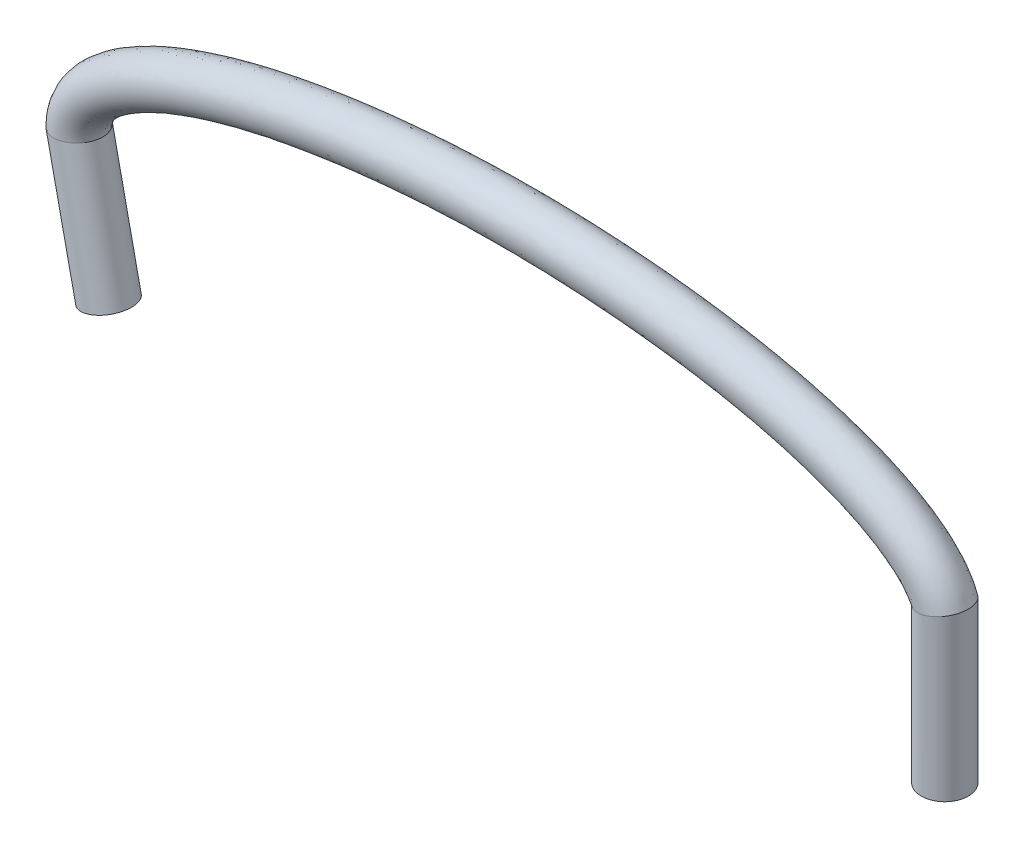
ISO-10303-21;
HEADER;
FILE_DESCRIPTION(('STEP AP214'),'2;1');
FILE_NAME('part.step','',(''),(''),'','','');
FILE_SCHEMA(('AUTOMOTIVE_DESIGN { 1 0 10303 214 1 1 1 1 }'));
ENDSEC;
DATA;
#1=APPLICATION_CONTEXT('core data for automotive mechanical design processes');
#2=APPLICATION_PROTOCOL_DEFINITION('international standard','automotive_design',2000,#1);
#3=PRODUCT_CONTEXT('',#1,'mechanical');
#4=PRODUCT('Part','Part','',(#3));
#5=PRODUCT_RELATED_PRODUCT_CATEGORY('part','',(#4));
#6=PRODUCT_DEFINITION_FORMATION('','',#4);
#7=PRODUCT_DEFINITION_CONTEXT('part definition',#1,'design');
#8=PRODUCT_DEFINITION('design','',#6,#7);
#9=PRODUCT_DEFINITION_SHAPE('','',#8);
#10=(LENGTH_UNIT() NAMED_UNIT(*) SI_UNIT(.MILLI.,.METRE.));
#11=(NAMED_UNIT(*) PLANE_ANGLE_UNIT() SI_UNIT($,.RADIAN.));
#12=(NAMED_UNIT(*) SI_UNIT($,.STERADIAN.) SOLID_ANGLE_UNIT());
#13=UNCERTAINTY_MEASURE_WITH_UNIT(LENGTH_MEASURE(1.E-05),#10,'distance_accuracy_value','');
#14=(GEOMETRIC_REPRESENTATION_CONTEXT(3) GLOBAL_UNCERTAINTY_ASSIGNED_CONTEXT((#13)) GLOBAL_UNIT_ASSIGNED_CONTEXT((#10,
#11,#12)) REPRESENTATION_CONTEXT('',''));
#15=CARTESIAN_POINT('',(0.,0.,0.));
#16=DIRECTION('',(0.,0.,1.));
#17=DIRECTION('',(1.,0.,0.));
#18=AXIS2_PLACEMENT_3D('',#15,#16,#17);
#19=CARTESIAN_POINT('',(18.5,-22.0918820107963,0.));
#20=DIRECTION('',(0.,1.,0.));
#21=DIRECTION('',(-1.,0.,0.));
#22=AXIS2_PLACEMENT_3D('',#19,#20,#21);
#23=PLANE('',#22);
#24=CARTESIAN_POINT('',(18.5,-22.0918820107963,0.));
#25=DIRECTION('',(0.,1.,0.));
#26=DIRECTION('',(-1.,0.,0.));
#27=AXIS2_PLACEMENT_3D('',#24,#25,#26);
#28=CIRCLE('',#27,1.);
#29=CARTESIAN_POINT('',(17.5,-22.0918820107963,0.));
#30=VERTEX_POINT('',#29);
#31=EDGE_CURVE('E36',#30,#30,#28,.T.);
#32=ORIENTED_EDGE('',*,*,#31,.F.);
#33=EDGE_LOOP('',(#32));
#34=FACE_BOUND('',#33,.T.);
#35=ADVANCED_FACE('F33',(#34),#23,.F.);
#36=CARTESIAN_POINT('',(-17.1053505367524,-22.0918820107963,0.));
#37=DIRECTION('',(0.210433069841335,-0.977608266698452,0.));
#38=DIRECTION('',(0.977608266698452,0.210433069841335,0.));
#39=AXIS2_PLACEMENT_3D('',#36,#37,#38);
#40=PLANE('',#39);
#41=CARTESIAN_POINT('',(-17.1053505367524,-22.0918820107963,0.));
#42=DIRECTION('',(0.210433069841335,-0.977608266698452,0.));
#43=DIRECTION('',(0.977608266698452,0.210433069841335,0.));
#44=AXIS2_PLACEMENT_3D('',#41,#42,#43);
#45=CIRCLE('',#44,1.);
#46=CARTESIAN_POINT('',(-16.127742270054,-21.881448940955,0.));
#47=VERTEX_POINT('',#46);
#48=EDGE_CURVE('E62',#47,#47,#45,.T.);
#49=ORIENTED_EDGE('',*,*,#48,.T.);
#50=EDGE_LOOP('',(#49));
#51=FACE_BOUND('',#50,.T.);
#52=ADVANCED_FACE('F115',(#51),#40,.T.);
#53=CARTESIAN_POINT('',(18.5,-15.0771752101522,0.));
#54=DIRECTION('',(0.,-1.,0.));
#55=DIRECTION('',(0.,0.,-1.));
#56=AXIS2_PLACEMENT_3D('',#53,#54,#55);
#57=CYLINDRICAL_SURFACE('',#56,1.);
#58=CARTESIAN_POINT('',(18.5,-15.3876234333942,-1.));
#59=CARTESIAN_POINT('',(18.5034071680893,-15.3869713902976,-1.00000011168417));
#60=CARTESIAN_POINT('',(18.5068148719893,-15.3863192490515,-0.999982686887696));
#61=CARTESIAN_POINT('',(18.5672662540041,-15.3747505856356,-0.999362886241515));
#62=CARTESIAN_POINT('',(18.6243976340839,-15.3638184812078,-0.993870405681347));
#63=CARTESIAN_POINT('',(18.7087591855946,-15.3476771138013,-0.978389097868317));
#64=CARTESIAN_POINT('',(18.7367013229754,-15.3423309992677,-0.972005306765891));
#65=CARTESIAN_POINT('',(18.7919850245974,-15.3317540272957,-0.956852060895181));
#66=CARTESIAN_POINT('',(18.8193260855698,-15.3265232664299,-0.948080683548789));
#67=CARTESIAN_POINT('',(18.8999563874864,-15.3110978814834,-0.918317684635702));
#68=CARTESIAN_POINT('',(18.9520451689388,-15.3011333390725,-0.893841721528193));
#69=CARTESIAN_POINT('',(19.0513799890603,-15.2821310366282,-0.836227049486676));
#70=CARTESIAN_POINT('',(19.0986263349762,-15.2730932177953,-0.80308889063311));
#71=CARTESIAN_POINT('',(19.1645253621273,-15.2604870561311,-0.747809866972191));
#72=CARTESIAN_POINT('',(19.1855713505741,-15.2564610182748,-0.728563482772165));
#73=CARTESIAN_POINT('',(19.2259542611553,-15.2487357527525,-0.688332931103869));
#74=CARTESIAN_POINT('',(19.245292805214,-15.2450362149413,-0.667350450300825));
#75=CARTESIAN_POINT('',(19.3005572813311,-15.2344636609964,-0.601962275481523));
#76=CARTESIAN_POINT('',(19.3337497235881,-15.2281133249264,-0.555101023317482));
#77=CARTESIAN_POINT('',(19.3911803361063,-15.217125845695,-0.457132697542114));
#78=CARTESIAN_POINT('',(19.4155635319205,-15.2124609551663,-0.406113139942955));
#79=CARTESIAN_POINT('',(19.4554216384327,-15.2048354527005,-0.300579503976562));
#80=CARTESIAN_POINT('',(19.4708975946214,-15.2018746407465,-0.246065836566953));
#81=CARTESIAN_POINT('',(19.4922666956468,-15.1977863744143,-0.136016244230443));
#82=CARTESIAN_POINT('',(19.4983061161599,-15.1966309349675,-0.08050969778011));
#83=CARTESIAN_POINT('',(19.5010745989969,-15.1961012781036,0.0307426813230176));
#84=CARTESIAN_POINT('',(19.4978041539728,-15.1967269664344,0.0864885011582694));
#85=CARTESIAN_POINT('',(19.4821135600055,-15.1997288411828,0.196223356533387));
#86=CARTESIAN_POINT('',(19.4697582203991,-15.2020926284431,0.250222021607091));
#87=CARTESIAN_POINT('',(19.4363572011949,-15.2084827803738,0.355355388444005));
#88=CARTESIAN_POINT('',(19.4153114181078,-15.212509164843,0.406490056093341));
#89=CARTESIAN_POINT('',(19.365058427566,-15.2221234559606,0.504708756647112));
#90=CARTESIAN_POINT('',(19.3358148028229,-15.2277183303207,0.551773459970292));
#91=CARTESIAN_POINT('',(19.2700823125392,-15.2402938006343,0.640323203424636));
#92=CARTESIAN_POINT('',(19.2335932975311,-15.2472744251747,0.68180812841914));
#93=CARTESIAN_POINT('',(19.1531536644653,-15.2626624951972,0.759349766379656));
#94=CARTESIAN_POINT('',(19.1090004441389,-15.271108679391,0.795188405156664));
#95=CARTESIAN_POINT('',(19.0153863001771,-15.289016447517,0.858823217676782));
#96=CARTESIAN_POINT('',(18.965924729475,-15.2984781552375,0.886618409426158));
#97=CARTESIAN_POINT('',(18.888868443815,-15.3132191919409,0.921727957884239));
#98=CARTESIAN_POINT('',(18.8626790537615,-15.3182293800204,0.932340981711951));
#99=CARTESIAN_POINT('',(18.8095497274686,-15.3283936248793,0.951301358408338));
#100=CARTESIAN_POINT('',(18.7826104811958,-15.3335475494102,0.959650722801023));
#101=CARTESIAN_POINT('',(18.7009928739623,-15.3491628817283,0.981201344359177));
#102=CARTESIAN_POINT('',(18.6453824506128,-15.3598031364425,0.990965142356056));
#103=CARTESIAN_POINT('',(18.5630848617622,-15.3755510463764,0.998360522662757));
#104=CARTESIAN_POINT('',(18.5366582422763,-15.3806080829113,0.999677668155914));
#105=CARTESIAN_POINT('',(18.5068153583288,-15.3863191559375,0.999982557937185));
#106=CARTESIAN_POINT('',(18.5034076815071,-15.3869712919978,0.999999973561581));
#107=CARTESIAN_POINT('',(18.5,-15.3876234333942,1.));
#108=B_SPLINE_CURVE_WITH_KNOTS('',3,(#58,#59,#60,#61,#62,#63,#64,#65,#66,#67,#68,#69,#70,#71,
#72,#73,#74,#75,#76,#77,#78,#79,#80,#81,#82,#83,#84,#85,#86,#87,#88,#89,#90,#91,#92,#93,#94,#95,
#96,#97,#98,#99,#100,#101,#102,#103,#104,#105,#106,#107),.UNSPECIFIED.,.F.,.F.,(4,2,2,2,2,2,2,2,
2,2,2,2,2,2,2,2,2,2,2,2,2,2,2,2,4),(0.,0.0104085368731022,0.184626497572387,0.272019280926984,
0.35948264562771,0.53381988188447,0.708146049791018,0.794460351780664,0.880691760144661,
1.05308556487375,1.22249583451572,1.39188621550336,1.55862386667755,1.72535269472822,
1.89090352129508,2.05645631936496,2.22275653598815,2.38906018362843,2.56072440330985,
2.73240957198708,2.81841818874864,2.90435012449157,3.07577712573474,3.15652570290149,
3.1669342397746),.UNSPECIFIED.);
#109=CARTESIAN_POINT('',(18.5,-15.3876234333942,1.));
#110=VERTEX_POINT('',#109);
#111=CARTESIAN_POINT('',(18.5,-15.3876234333942,-1.));
#112=VERTEX_POINT('',#111);
#113=EDGE_CURVE('E58',#110,#112,#108,.F.);
#114=ORIENTED_EDGE('',*,*,#113,.F.);
#115=CARTESIAN_POINT('',(18.5,-15.3876234333942,-1.));
#116=CARTESIAN_POINT('',(18.4965928286844,-15.3882754804214,-1.00000011070626));
#117=CARTESIAN_POINT('',(18.493185266396,-15.3889283598357,-0.999982686021337));
#118=CARTESIAN_POINT('',(18.4326169540965,-15.4005464738293,-0.999361726896883));
#119=CARTESIAN_POINT('',(18.3754082447468,-15.4117321803997,-0.993848499097518));
#120=CARTESIAN_POINT('',(18.290987589085,-15.4285353492138,-0.97833567478781));
#121=CARTESIAN_POINT('',(18.2630349749947,-15.43414968744,-0.971941188813213));
#122=CARTESIAN_POINT('',(18.20774780652,-15.4453558543851,-0.956770592280345));
#123=CARTESIAN_POINT('',(18.1804137566035,-15.4509476618766,-0.947992608686158));
#124=CARTESIAN_POINT('',(18.0997791263223,-15.467601095226,-0.91820409508037));
#125=CARTESIAN_POINT('',(18.0477039840717,-15.4785690132444,-0.893712741458573));
#126=CARTESIAN_POINT('',(17.9484317991619,-15.4999259046885,-0.8361013047111));
#127=CARTESIAN_POINT('',(17.90123464272,-15.5103148916156,-0.802981422915928));
#128=CARTESIAN_POINT('',(17.8352677207173,-15.5251692281471,-0.747631713316786));
#129=CARTESIAN_POINT('',(17.814115858528,-15.5299914656301,-0.728275027798148));
#130=CARTESIAN_POINT('',(17.7735391472838,-15.5393475940673,-0.687804637185025));
#131=CARTESIAN_POINT('',(17.7541126630433,-15.5438817568515,-0.666692633207164));
#132=CARTESIAN_POINT('',(17.6986089702993,-15.5569762452922,-0.60088231168597));
#133=CARTESIAN_POINT('',(17.6652896892878,-15.5650326207414,-0.553694718162623));
#134=CARTESIAN_POINT('',(17.6077198107193,-15.5791499800577,-0.455019697835641));
#135=CARTESIAN_POINT('',(17.5833137905301,-15.5852449167796,-0.403627240238924));
#136=CARTESIAN_POINT('',(17.5435174494442,-15.5952472230538,-0.297257056986469));
#137=CARTESIAN_POINT('',(17.5281251527682,-15.5991550720003,-0.242280119975515));
#138=CARTESIAN_POINT('',(17.5072095003438,-15.6044740481307,-0.132009436559815));
#139=CARTESIAN_POINT('',(17.501415116711,-15.6059537306695,-0.0767702474726794));
#140=CARTESIAN_POINT('',(17.4990440537265,-15.6065587261244,0.0339161797406809));
#141=CARTESIAN_POINT('',(17.5024664159315,-15.6056842838445,0.0893633956355612));
#142=CARTESIAN_POINT('',(17.5182889503006,-15.6016547129845,0.198023691642245));
#143=CARTESIAN_POINT('',(17.5305543766291,-15.5985338158104,0.251257764392653));
#144=CARTESIAN_POINT('',(17.563507534427,-15.590213426274,0.354877535001122));
#145=CARTESIAN_POINT('',(17.5841956662577,-15.5850138351041,0.405263097329649));
#146=CARTESIAN_POINT('',(17.6335891731106,-15.5727801243212,0.502321285025942));
#147=CARTESIAN_POINT('',(17.6623712687706,-15.5657284941628,0.548952599006745));
#148=CARTESIAN_POINT('',(17.7270078351728,-15.5502308199874,0.636754080261269));
#149=CARTESIAN_POINT('',(17.7628626158205,-15.5417847148711,0.677924008099926));
#150=CARTESIAN_POINT('',(17.8417245915707,-15.5236565028578,0.754844416202184));
#151=CARTESIAN_POINT('',(17.8849017540144,-15.5139467350507,0.790414146232975));
#152=CARTESIAN_POINT('',(17.9764626523598,-15.4938372761149,0.853820929733084));
#153=CARTESIAN_POINT('',(18.0248471170079,-15.4834374884982,0.881656898928594));
#154=CARTESIAN_POINT('',(18.1271003382322,-15.4619032008121,0.929643765325305));
#155=CARTESIAN_POINT('',(18.1810949599659,-15.4507558418426,0.949520578822793));
#156=CARTESIAN_POINT('',(18.2915770959666,-15.4283668013295,0.979708611362492));
#157=CARTESIAN_POINT('',(18.3480591935981,-15.4171253640919,0.990039633226803));
#158=CARTESIAN_POINT('',(18.4331674927052,-15.4004930557871,0.998167167018431));
#159=CARTESIAN_POINT('',(18.4614642743821,-15.3950130447986,0.999658382655558));
#160=CARTESIAN_POINT('',(18.4931848360287,-15.388928440405,0.9999825724651));
#161=CARTESIAN_POINT('',(18.4965923776406,-15.3882755646922,0.999999990001254));
#162=CARTESIAN_POINT('',(18.5,-15.3876234333942,1.));
#163=B_SPLINE_CURVE_WITH_KNOTS('',3,(#115,#116,#117,#118,#119,#120,#121,#122,#123,#124,#125,
#126,#127,#128,#129,#130,#131,#132,#133,#134,#135,#136,#137,#138,#139,#140,#141,#142,#143,#144,
#145,#146,#147,#148,#149,#150,#151,#152,#153,#154,#155,#156,#157,#158,#159,#160,#161,#162),
.UNSPECIFIED.,.F.,.F.,(4,2,2,2,2,2,2,2,2,2,2,2,2,2,2,2,2,2,2,2,2,2,2,4),(0.,0.0104085370919459,
0.184999077114313,0.272580610187836,0.360231168084822,0.535096322302397,0.70995739673527,
0.797088225139303,0.884135576042009,1.0581603136131,1.22898655867591,1.39977534514605,
1.56565360177947,1.73151460950934,1.89490033036613,2.05829381843569,2.22329153678548,
2.38829648648479,2.55785153672906,2.72743034662135,2.90242954005248,3.07706487576931,
3.16355545329765,3.17396399038966),.UNSPECIFIED.);
#164=EDGE_CURVE('E56',#110,#112,#163,.F.);
#165=ORIENTED_EDGE('',*,*,#164,.T.);
#166=EDGE_LOOP('',(#114,#165));
#167=FACE_BOUND('',#166,.T.);
#168=ORIENTED_EDGE('',*,*,#31,.T.);
#169=EDGE_LOOP('',(#168));
#170=FACE_BOUND('',#169,.T.);
#171=ADVANCED_FACE('F64',(#167,#170),#57,.T.);
#172=CARTESIAN_POINT('',(-17.3568653846911,-16.5227642811263,0.));
#173=CARTESIAN_POINT('',(-17.3560700431756,-16.4484340160359,0.));
#174=CARTESIAN_POINT('',(-17.3550663942075,-16.3542039101617,0.));
#175=CARTESIAN_POINT('',(-17.354115125704,-16.2660012802277,0.));
#176=CARTESIAN_POINT('',(-17.3532299627587,-16.2568803379146,0.));
#177=CARTESIAN_POINT('',(-17.3495523719888,-16.2135066566741,0.));
#178=CARTESIAN_POINT('',(-17.3468945255966,-16.1916005806689,0.));
#179=CARTESIAN_POINT('',(-17.3362709570493,-16.1247526938911,0.));
#180=CARTESIAN_POINT('',(-17.3256715369799,-16.0786444626232,0.));
#181=CARTESIAN_POINT('',(-17.2808629055453,-15.9330032470519,0.));
#182=CARTESIAN_POINT('',(-17.2334223268091,-15.8256748279237,0.));
#183=CARTESIAN_POINT('',(-17.0173676702873,-15.4710823820133,0.));
#184=CARTESIAN_POINT('',(-16.7716181071438,-15.1926492796887,0.));
#185=CARTESIAN_POINT('',(-15.686295899535,-14.3239488867966,0.));
#186=CARTESIAN_POINT('',(-14.5062444521368,-13.7154044226635,0.));
#187=CARTESIAN_POINT('',(-9.93849786971495,-12.1551463252879,0.));
#188=CARTESIAN_POINT('',(-5.51309893519682,-11.4658770701229,0.));
#189=CARTESIAN_POINT('',(3.5994306311149,-11.2429867241933,0.));
#190=CARTESIAN_POINT('',(8.25032867143602,-11.7071883405302,0.));
#191=CARTESIAN_POINT('',(13.4303489321272,-13.0454205527017,0.));
#192=CARTESIAN_POINT('',(14.8610452288692,-13.5961843537459,0.));
#193=CARTESIAN_POINT('',(16.3682732211967,-14.461097846119,0.));
#194=CARTESIAN_POINT('',(16.7633588713221,-14.7546905306458,0.));
#195=CARTESIAN_POINT('',(17.1853485218015,-15.1658906725606,0.));
#196=CARTESIAN_POINT('',(17.2976657476761,-15.2977032962204,0.));
#197=CARTESIAN_POINT('',(17.4270011429015,-15.4812839998081,0.));
#198=CARTESIAN_POINT('',(17.4636470404202,-15.5401196303962,0.));
#199=CARTESIAN_POINT('',(17.5253562827948,-15.6524376717752,0.));
#200=CARTESIAN_POINT('',(17.5423922560269,-15.6856921085446,0.));
#201=CARTESIAN_POINT('',(17.5854929929327,-15.7941865625705,0.));
#202=CARTESIAN_POINT('',(17.6088170576842,-15.8529208017803,0.));
#203=CARTESIAN_POINT('',(17.6470148658633,-15.9490956693489,0.));
#204=CARTESIAN_POINT('',(17.6661137699527,-15.9971831031331,0.));
#205=CARTESIAN_POINT('',(17.6852126740424,-16.0452705369178,0.));
#206=CARTESIAN_POINT('',(-17.3568653846911,-16.5227642811263,2.));
#207=CARTESIAN_POINT('',(-17.3560700431756,-16.4484340160359,2.));
#208=CARTESIAN_POINT('',(-17.3550663942075,-16.3542039101617,2.));
#209=CARTESIAN_POINT('',(-17.354115125704,-16.2660012802277,2.));
#210=CARTESIAN_POINT('',(-17.3532299627587,-16.2568803379146,2.));
#211=CARTESIAN_POINT('',(-17.3495523719888,-16.2135066566741,2.));
#212=CARTESIAN_POINT('',(-17.3468945255966,-16.1916005806689,2.));
#213=CARTESIAN_POINT('',(-17.3362709570493,-16.1247526938911,2.));
#214=CARTESIAN_POINT('',(-17.3256715369799,-16.0786444626232,2.));
#215=CARTESIAN_POINT('',(-17.2808629055453,-15.9330032470519,2.));
#216=CARTESIAN_POINT('',(-17.2334223268091,-15.8256748279237,2.));
#217=CARTESIAN_POINT('',(-17.0173676702873,-15.4710823820133,2.));
#218=CARTESIAN_POINT('',(-16.7716181071438,-15.1926492796887,2.));
#219=CARTESIAN_POINT('',(-15.686295899535,-14.3239488867966,2.));
#220=CARTESIAN_POINT('',(-14.5062444521368,-13.7154044226635,2.));
#221=CARTESIAN_POINT('',(-9.93849786971495,-12.1551463252879,2.));
#222=CARTESIAN_POINT('',(-5.51309893519682,-11.4658770701229,2.));
#223=CARTESIAN_POINT('',(3.5994306311149,-11.2429867241933,2.));
#224=CARTESIAN_POINT('',(8.25032867143602,-11.7071883405302,2.));
#225=CARTESIAN_POINT('',(13.4303489321272,-13.0454205527017,2.));
#226=CARTESIAN_POINT('',(14.8610452288692,-13.5961843537459,2.));
#227=CARTESIAN_POINT('',(16.3682732211967,-14.461097846119,2.));
#228=CARTESIAN_POINT('',(16.7633588713221,-14.7546905306458,2.));
#229=CARTESIAN_POINT('',(17.1853485218015,-15.1658906725606,2.));
#230=CARTESIAN_POINT('',(17.2976657476761,-15.2977032962204,2.));
#231=CARTESIAN_POINT('',(17.4270011429015,-15.4812839998081,2.));
#232=CARTESIAN_POINT('',(17.4636470404202,-15.5401196303962,2.));
#233=CARTESIAN_POINT('',(17.5253562827948,-15.6524376717752,2.));
#234=CARTESIAN_POINT('',(17.5423922560269,-15.6856921085446,2.));
#235=CARTESIAN_POINT('',(17.5854929929327,-15.7941865625705,2.));
#236=CARTESIAN_POINT('',(17.6088170576842,-15.8529208017803,2.));
#237=CARTESIAN_POINT('',(17.6470148658633,-15.9490956693489,2.));
#238=CARTESIAN_POINT('',(17.6661137699527,-15.9971831031331,2.));
#239=CARTESIAN_POINT('',(17.6852126740424,-16.0452705369178,2.));
#240=CARTESIAN_POINT('',(-19.3567509023106,-16.5013652994733,2.));
#241=CARTESIAN_POINT('',(-19.3559555607951,-16.4270350343828,2.));
#242=CARTESIAN_POINT('',(-19.3553884297776,-16.3726046739087,2.));
#243=CARTESIAN_POINT('',(-19.3537297989534,-16.219907925847,2.));
#244=CARTESIAN_POINT('',(-19.3502229480478,-16.1367788015735,2.));
#245=CARTESIAN_POINT('',(-19.3382582681438,-15.9956667388324,2.));
#246=CARTESIAN_POINT('',(-19.329678106729,-15.9253372045082,2.));
#247=CARTESIAN_POINT('',(-19.2963413250764,-15.7155683123746,2.));
#248=CARTESIAN_POINT('',(-19.2639688185088,-15.5773832627057,2.));
#249=CARTESIAN_POINT('',(-19.1389873190726,-15.1711565642984,2.));
#250=CARTESIAN_POINT('',(-19.0186915863862,-14.9119444147794,2.));
#251=CARTESIAN_POINT('',(-18.5706352949816,-14.1765869946014,2.));
#252=CARTESIAN_POINT('',(-18.1593221968438,-13.7416191926326,2.));
#253=CARTESIAN_POINT('',(-16.6602227844017,-12.5417282648995,2.));
#254=CARTESIAN_POINT('',(-15.296166832114,-11.8717676579409,2.));
#255=CARTESIAN_POINT('',(-10.2981170931632,-10.1645259267802,2.));
#256=CARTESIAN_POINT('',(-5.72197823142651,-9.47038801822618,2.));
#257=CARTESIAN_POINT('',(3.7105001155763,-9.2396717998089,2.));
#258=CARTESIAN_POINT('',(8.50624680750284,-9.70763932423022,2.));
#259=CARTESIAN_POINT('',(14.0527876652019,-11.1405602920568,2.));
#260=CARTESIAN_POINT('',(15.631602710787,-11.7324613695059,2.));
#261=CARTESIAN_POINT('',(17.4761464290715,-12.7909414179137,2.));
#262=CARTESIAN_POINT('',(18.0051706135181,-13.1722490223904,2.));
#263=CARTESIAN_POINT('',(18.6581171397731,-13.8085009143293,2.));
#264=CARTESIAN_POINT('',(18.8522033057169,-14.031636417053,2.));
#265=CARTESIAN_POINT('',(19.1022146522738,-14.3865065049665,2.));
#266=CARTESIAN_POINT('',(19.1786473748402,-14.5081520154196,2.));
#267=CARTESIAN_POINT('',(19.3160849755285,-14.7583045655609,2.));
#268=CARTESIAN_POINT('',(19.3850939264282,-14.9070375702809,2.));
#269=CARTESIAN_POINT('',(19.4527169537961,-15.0772346922898,2.));
#270=CARTESIAN_POINT('',(19.4675785586741,-15.1146758001459,2.));
#271=CARTESIAN_POINT('',(19.505776366853,-15.2108506677145,2.));
#272=CARTESIAN_POINT('',(19.5248752709428,-15.2589381014987,2.));
#273=CARTESIAN_POINT('',(19.5439741750322,-15.3070255352834,2.));
#274=CARTESIAN_POINT('',(-19.3567509023106,-16.5013652994733,0.));
#275=CARTESIAN_POINT('',(-19.3559555607951,-16.4270350343828,0.));
#276=CARTESIAN_POINT('',(-19.3553884297776,-16.3726046739087,0.));
#277=CARTESIAN_POINT('',(-19.3537297989534,-16.219907925847,0.));
#278=CARTESIAN_POINT('',(-19.3502229480478,-16.1367788015735,0.));
#279=CARTESIAN_POINT('',(-19.3382582681438,-15.9956667388324,0.));
#280=CARTESIAN_POINT('',(-19.329678106729,-15.9253372045082,0.));
#281=CARTESIAN_POINT('',(-19.2963413250764,-15.7155683123746,0.));
#282=CARTESIAN_POINT('',(-19.2639688185088,-15.5773832627057,0.));
#283=CARTESIAN_POINT('',(-19.1389873190726,-15.1711565642984,0.));
#284=CARTESIAN_POINT('',(-19.0186915863862,-14.9119444147794,0.));
#285=CARTESIAN_POINT('',(-18.5706352949816,-14.1765869946014,0.));
#286=CARTESIAN_POINT('',(-18.1593221968438,-13.7416191926326,0.));
#287=CARTESIAN_POINT('',(-16.6602227844017,-12.5417282648995,0.));
#288=CARTESIAN_POINT('',(-15.296166832114,-11.8717676579409,0.));
#289=CARTESIAN_POINT('',(-10.2981170931632,-10.1645259267802,0.));
#290=CARTESIAN_POINT('',(-5.72197823142651,-9.47038801822618,0.));
#291=CARTESIAN_POINT('',(3.7105001155763,-9.2396717998089,0.));
#292=CARTESIAN_POINT('',(8.50624680750284,-9.70763932423022,0.));
#293=CARTESIAN_POINT('',(14.0527876652019,-11.1405602920568,0.));
#294=CARTESIAN_POINT('',(15.631602710787,-11.7324613695059,0.));
#295=CARTESIAN_POINT('',(17.4761464290715,-12.7909414179137,0.));
#296=CARTESIAN_POINT('',(18.0051706135181,-13.1722490223904,0.));
#297=CARTESIAN_POINT('',(18.6581171397731,-13.8085009143293,0.));
#298=CARTESIAN_POINT('',(18.8522033057169,-14.031636417053,0.));
#299=CARTESIAN_POINT('',(19.1022146522738,-14.3865065049665,0.));
#300=CARTESIAN_POINT('',(19.1786473748402,-14.5081520154196,0.));
#301=CARTESIAN_POINT('',(19.3160849755285,-14.7583045655609,0.));
#302=CARTESIAN_POINT('',(19.3850939264282,-14.9070375702809,0.));
#303=CARTESIAN_POINT('',(19.4527169537961,-15.0772346922898,0.));
#304=CARTESIAN_POINT('',(19.4675785586741,-15.1146758001459,0.));
#305=CARTESIAN_POINT('',(19.505776366853,-15.2108506677145,0.));
#306=CARTESIAN_POINT('',(19.5248752709428,-15.2589381014987,0.));
#307=CARTESIAN_POINT('',(19.5439741750322,-15.3070255352834,0.));
#308=CARTESIAN_POINT('',(-19.3567509023106,-16.5013652994733,-2.));
#309=CARTESIAN_POINT('',(-19.3559555607951,-16.4270350343828,-2.));
#310=CARTESIAN_POINT('',(-19.3553884297776,-16.3726046739087,-2.));
#311=CARTESIAN_POINT('',(-19.3537297989534,-16.219907925847,-2.));
#312=CARTESIAN_POINT('',(-19.3502229480478,-16.1367788015735,-2.));
#313=CARTESIAN_POINT('',(-19.3382582681438,-15.9956667388324,-2.));
#314=CARTESIAN_POINT('',(-19.329678106729,-15.9253372045082,-2.));
#315=CARTESIAN_POINT('',(-19.2963413250764,-15.7155683123746,-2.));
#316=CARTESIAN_POINT('',(-19.2639688185088,-15.5773832627057,-2.));
#317=CARTESIAN_POINT('',(-19.1389873190726,-15.1711565642984,-2.));
#318=CARTESIAN_POINT('',(-19.0186915863862,-14.9119444147794,-2.));
#319=CARTESIAN_POINT('',(-18.5706352949816,-14.1765869946014,-2.));
#320=CARTESIAN_POINT('',(-18.1593221968438,-13.7416191926326,-2.));
#321=CARTESIAN_POINT('',(-16.6602227844017,-12.5417282648995,-2.));
#322=CARTESIAN_POINT('',(-15.296166832114,-11.8717676579409,-2.));
#323=CARTESIAN_POINT('',(-10.2981170931632,-10.1645259267802,-2.));
#324=CARTESIAN_POINT('',(-5.72197823142651,-9.47038801822618,-2.));
#325=CARTESIAN_POINT('',(3.7105001155763,-9.2396717998089,-2.));
#326=CARTESIAN_POINT('',(8.50624680750284,-9.70763932423022,-2.));
#327=CARTESIAN_POINT('',(14.0527876652019,-11.1405602920568,-2.));
#328=CARTESIAN_POINT('',(15.631602710787,-11.7324613695059,-2.));
#329=CARTESIAN_POINT('',(17.4761464290715,-12.7909414179137,-2.));
#330=CARTESIAN_POINT('',(18.0051706135181,-13.1722490223904,-2.));
#331=CARTESIAN_POINT('',(18.6581171397731,-13.8085009143293,-2.));
#332=CARTESIAN_POINT('',(18.8522033057169,-14.031636417053,-2.));
#333=CARTESIAN_POINT('',(19.1022146522738,-14.3865065049665,-2.));
#334=CARTESIAN_POINT('',(19.1786473748402,-14.5081520154196,-2.));
#335=CARTESIAN_POINT('',(19.3160849755285,-14.7583045655609,-2.));
#336=CARTESIAN_POINT('',(19.3850939264282,-14.9070375702809,-2.));
#337=CARTESIAN_POINT('',(19.4527169537961,-15.0772346922898,-2.));
#338=CARTESIAN_POINT('',(19.4675785586741,-15.1146758001459,-2.));
#339=CARTESIAN_POINT('',(19.505776366853,-15.2108506677145,-2.));
#340=CARTESIAN_POINT('',(19.5248752709428,-15.2589381014987,-2.));
#341=CARTESIAN_POINT('',(19.5439741750322,-15.3070255352834,-2.));
#342=CARTESIAN_POINT('',(-17.3568653846911,-16.5227642811263,-2.));
#343=CARTESIAN_POINT('',(-17.3560700431756,-16.4484340160359,-2.));
#344=CARTESIAN_POINT('',(-17.3550663942075,-16.3542039101617,-2.));
#345=CARTESIAN_POINT('',(-17.354115125704,-16.2660012802277,-2.));
#346=CARTESIAN_POINT('',(-17.3532299627587,-16.2568803379146,-2.));
#347=CARTESIAN_POINT('',(-17.3495523719888,-16.2135066566741,-2.));
#348=CARTESIAN_POINT('',(-17.3468945255966,-16.1916005806689,-2.));
#349=CARTESIAN_POINT('',(-17.3362709570493,-16.1247526938911,-2.));
#350=CARTESIAN_POINT('',(-17.3256715369799,-16.0786444626232,-2.));
#351=CARTESIAN_POINT('',(-17.2808629055453,-15.9330032470519,-2.));
#352=CARTESIAN_POINT('',(-17.2334223268091,-15.8256748279237,-2.));
#353=CARTESIAN_POINT('',(-17.0173676702873,-15.4710823820133,-2.));
#354=CARTESIAN_POINT('',(-16.7716181071438,-15.1926492796887,-2.));
#355=CARTESIAN_POINT('',(-15.686295899535,-14.3239488867966,-2.));
#356=CARTESIAN_POINT('',(-14.5062444521368,-13.7154044226635,-2.));
#357=CARTESIAN_POINT('',(-9.93849786971495,-12.1551463252879,-2.));
#358=CARTESIAN_POINT('',(-5.51309893519682,-11.4658770701229,-2.));
#359=CARTESIAN_POINT('',(3.5994306311149,-11.2429867241933,-2.));
#360=CARTESIAN_POINT('',(8.25032867143602,-11.7071883405302,-2.));
#361=CARTESIAN_POINT('',(13.4303489321272,-13.0454205527017,-2.));
#362=CARTESIAN_POINT('',(14.8610452288692,-13.5961843537459,-2.));
#363=CARTESIAN_POINT('',(16.3682732211967,-14.461097846119,-2.));
#364=CARTESIAN_POINT('',(16.7633588713221,-14.7546905306458,-2.));
#365=CARTESIAN_POINT('',(17.1853485218015,-15.1658906725606,-2.));
#366=CARTESIAN_POINT('',(17.2976657476761,-15.2977032962204,-2.));
#367=CARTESIAN_POINT('',(17.4270011429015,-15.4812839998081,-2.));
#368=CARTESIAN_POINT('',(17.4636470404202,-15.5401196303962,-2.));
#369=CARTESIAN_POINT('',(17.5253562827948,-15.6524376717752,-2.));
#370=CARTESIAN_POINT('',(17.5423922560269,-15.6856921085446,-2.));
#371=CARTESIAN_POINT('',(17.5854929929327,-15.7941865625705,-2.));
#372=CARTESIAN_POINT('',(17.6088170576842,-15.8529208017803,-2.));
#373=CARTESIAN_POINT('',(17.6470148658633,-15.9490956693489,-2.));
#374=CARTESIAN_POINT('',(17.6661137699527,-15.9971831031331,-2.));
#375=CARTESIAN_POINT('',(17.6852126740424,-16.0452705369178,-2.));
#376=CARTESIAN_POINT('',(-17.3568653846911,-16.5227642811263,0.));
#377=CARTESIAN_POINT('',(-17.3560700431756,-16.4484340160359,0.));
#378=CARTESIAN_POINT('',(-17.3550663942075,-16.3542039101617,0.));
#379=CARTESIAN_POINT('',(-17.354115125704,-16.2660012802277,0.));
#380=CARTESIAN_POINT('',(-17.3532299627587,-16.2568803379146,0.));
#381=CARTESIAN_POINT('',(-17.3495523719888,-16.2135066566741,0.));
#382=CARTESIAN_POINT('',(-17.3468945255966,-16.1916005806689,0.));
#383=CARTESIAN_POINT('',(-17.3362709570493,-16.1247526938911,0.));
#384=CARTESIAN_POINT('',(-17.3256715369799,-16.0786444626232,0.));
#385=CARTESIAN_POINT('',(-17.2808629055453,-15.9330032470519,0.));
#386=CARTESIAN_POINT('',(-17.2334223268091,-15.8256748279237,0.));
#387=CARTESIAN_POINT('',(-17.0173676702873,-15.4710823820133,0.));
#388=CARTESIAN_POINT('',(-16.7716181071438,-15.1926492796887,0.));
#389=CARTESIAN_POINT('',(-15.686295899535,-14.3239488867966,0.));
#390=CARTESIAN_POINT('',(-14.5062444521368,-13.7154044226635,0.));
#391=CARTESIAN_POINT('',(-9.93849786971495,-12.1551463252879,0.));
#392=CARTESIAN_POINT('',(-5.51309893519682,-11.4658770701229,0.));
#393=CARTESIAN_POINT('',(3.5994306311149,-11.2429867241933,0.));
#394=CARTESIAN_POINT('',(8.25032867143602,-11.7071883405302,0.));
#395=CARTESIAN_POINT('',(13.4303489321272,-13.0454205527017,0.));
#396=CARTESIAN_POINT('',(14.8610452288692,-13.5961843537459,0.));
#397=CARTESIAN_POINT('',(16.3682732211967,-14.461097846119,0.));
#398=CARTESIAN_POINT('',(16.7633588713221,-14.7546905306458,0.));
#399=CARTESIAN_POINT('',(17.1853485218015,-15.1658906725606,0.));
#400=CARTESIAN_POINT('',(17.2976657476761,-15.2977032962204,0.));
#401=CARTESIAN_POINT('',(17.4270011429015,-15.4812839998081,0.));
#402=CARTESIAN_POINT('',(17.4636470404202,-15.5401196303962,0.));
#403=CARTESIAN_POINT('',(17.5253562827948,-15.6524376717752,0.));
#404=CARTESIAN_POINT('',(17.5423922560269,-15.6856921085446,0.));
#405=CARTESIAN_POINT('',(17.5854929929327,-15.7941865625705,0.));
#406=CARTESIAN_POINT('',(17.6088170576842,-15.8529208017803,0.));
#407=CARTESIAN_POINT('',(17.6470148658633,-15.9490956693489,0.));
#408=CARTESIAN_POINT('',(17.6661137699527,-15.9971831031331,0.));
#409=CARTESIAN_POINT('',(17.6852126740424,-16.0452705369178,0.));
#410=(BOUNDED_SURFACE() B_SPLINE_SURFACE(3,3,((#172,#173,#174,#175,#176,#177,#178,#179,#180,
#181,#182,#183,#184,#185,#186,#187,#188,#189,#190,#191,#192,#193,#194,#195,#196,#197,#198,#199,
#200,#201,#202,#203,#204,#205),(#206,#207,#208,#209,#210,#211,#212,#213,#214,#215,#216,#217,
#218,#219,#220,#221,#222,#223,#224,#225,#226,#227,#228,#229,#230,#231,#232,#233,#234,#235,#236,
#237,#238,#239),(#240,#241,#242,#243,#244,#245,#246,#247,#248,#249,#250,#251,#252,#253,#254,
#255,#256,#257,#258,#259,#260,#261,#262,#263,#264,#265,#266,#267,#268,#269,#270,#271,#272,#273),
(#274,#275,#276,#277,#278,#279,#280,#281,#282,#283,#284,#285,#286,#287,#288,#289,#290,#291,#292,
#293,#294,#295,#296,#297,#298,#299,#300,#301,#302,#303,#304,#305,#306,#307),(#308,#309,#310,
#311,#312,#313,#314,#315,#316,#317,#318,#319,#320,#321,#322,#323,#324,#325,#326,#327,#328,#329,
#330,#331,#332,#333,#334,#335,#336,#337,#338,#339,#340,#341),(#342,#343,#344,#345,#346,#347,
#348,#349,#350,#351,#352,#353,#354,#355,#356,#357,#358,#359,#360,#361,#362,#363,#364,#365,#366,
#367,#368,#369,#370,#371,#372,#373,#374,#375),(#376,#377,#378,#379,#380,#381,#382,#383,#384,
#385,#386,#387,#388,#389,#390,#391,#392,#393,#394,#395,#396,#397,#398,#399,#400,#401,#402,#403,
#404,#405,#406,#407,#408,#409)),.UNSPECIFIED.,.T.,.F.,.F.) B_SPLINE_SURFACE_WITH_KNOTS((4,3,4),
(4,2,2,2,2,2,2,2,2,2,2,2,2,2,2,2,4),(0.,0.5,1.),(-0.0125913508460398,0.,0.0078125,0.015625,
0.03125,0.0625,0.125,0.25,0.5,0.75,0.875,0.9375,0.96875,0.984375,1.,1.0082333331474,
1.01646666629481),.UNSPECIFIED.) GEOMETRIC_REPRESENTATION_ITEM() RATIONAL_B_SPLINE_SURFACE(((1.,
1.,1.,1.,1.,1.,1.,1.,1.,1.,1.,1.,1.,1.,1.,1.,1.,1.,1.,1.,1.,1.,1.,1.,1.,1.,1.,1.,1.,1.,1.,1.,1.,
1.),(0.333333333333333,0.333333333333333,0.333333333333333,0.333333333333333,0.333333333333333,
0.333333333333333,0.333333333333333,0.333333333333333,0.333333333333333,0.333333333333333,
0.333333333333333,0.333333333333333,0.333333333333333,0.333333333333333,0.333333333333333,
0.333333333333333,0.333333333333333,0.333333333333333,0.333333333333333,0.333333333333333,
0.333333333333333,0.333333333333333,0.333333333333333,0.333333333333333,0.333333333333333,
0.333333333333333,0.333333333333333,0.333333333333333,0.333333333333333,0.333333333333333,
0.333333333333333,0.333333333333333,0.333333333333333,0.333333333333333),(0.333333333333333,
0.333333333333333,0.333333333333333,0.333333333333333,0.333333333333333,0.333333333333333,
0.333333333333333,0.333333333333333,0.333333333333333,0.333333333333333,0.333333333333333,
0.333333333333333,0.333333333333333,0.333333333333333,0.333333333333333,0.333333333333333,
0.333333333333333,0.333333333333333,0.333333333333333,0.333333333333333,0.333333333333333,
0.333333333333333,0.333333333333333,0.333333333333333,0.333333333333333,0.333333333333333,
0.333333333333333,0.333333333333333,0.333333333333333,0.333333333333333,0.333333333333333,
0.333333333333333,0.333333333333333,0.333333333333333),(1.,1.,1.,1.,1.,1.,1.,1.,1.,1.,1.,1.,1.,
1.,1.,1.,1.,1.,1.,1.,1.,1.,1.,1.,1.,1.,1.,1.,1.,1.,1.,1.,1.,1.),(0.333333333333333,
0.333333333333333,0.333333333333333,0.333333333333333,0.333333333333333,0.333333333333333,
0.333333333333333,0.333333333333333,0.333333333333333,0.333333333333333,0.333333333333333,
0.333333333333333,0.333333333333333,0.333333333333333,0.333333333333333,0.333333333333333,
0.333333333333333,0.333333333333333,0.333333333333333,0.333333333333333,0.333333333333333,
0.333333333333333,0.333333333333333,0.333333333333333,0.333333333333333,0.333333333333333,
0.333333333333333,0.333333333333333,0.333333333333333,0.333333333333333,0.333333333333333,
0.333333333333333,0.333333333333333,0.333333333333333),(0.333333333333333,0.333333333333333,
0.333333333333333,0.333333333333333,0.333333333333333,0.333333333333333,0.333333333333333,
0.333333333333333,0.333333333333333,0.333333333333333,0.333333333333333,0.333333333333333,
0.333333333333333,0.333333333333333,0.333333333333333,0.333333333333333,0.333333333333333,
0.333333333333333,0.333333333333333,0.333333333333333,0.333333333333333,0.333333333333333,
0.333333333333333,0.333333333333333,0.333333333333333,0.333333333333333,0.333333333333333,
0.333333333333333,0.333333333333333,0.333333333333333,0.333333333333333,0.333333333333333,
0.333333333333333,0.333333333333333),(1.,1.,1.,1.,1.,1.,1.,1.,1.,1.,1.,1.,1.,1.,1.,1.,1.,1.,1.,
1.,1.,1.,1.,1.,1.,1.,1.,1.,1.,1.,1.,1.,1.,1.))) REPRESENTATION_ITEM('') SURFACE());
#411=CARTESIAN_POINT('',(-18.3544221189536,-16.2890739950284,-1.));
#412=CARTESIAN_POINT('',(-18.3499609502769,-16.2886237284777,-1.00000014988496));
#413=CARTESIAN_POINT('',(-18.3454990096247,-16.2881742626192,-0.999970345158019));
#414=CARTESIAN_POINT('',(-18.2845046123503,-16.2820420680786,-0.999154043892217));
#415=CARTESIAN_POINT('',(-18.227921770697,-16.2764939455541,-0.993596090530858));
#416=CARTESIAN_POINT('',(-18.1163583824975,-16.2658299244642,-0.973012192356243));
#417=CARTESIAN_POINT('',(-18.0613825989524,-16.2607152392385,-0.957960604243117));
#418=CARTESIAN_POINT('',(-17.9547352955037,-16.2511180972921,-0.918814374641657));
#419=CARTESIAN_POINT('',(-17.9030607576176,-16.2466350584682,-0.89472813515143));
#420=CARTESIAN_POINT('',(-17.8044741566069,-16.2384849175563,-0.838208319556357));
#421=CARTESIAN_POINT('',(-17.7575591589768,-16.2348173110288,-0.805779930973985));
#422=CARTESIAN_POINT('',(-17.6698088711994,-16.2283720567273,-0.733486255074793));
#423=CARTESIAN_POINT('',(-17.628971791295,-16.2255941466868,-0.69362316486708));
#424=CARTESIAN_POINT('',(-17.5545966465511,-16.2206889919706,-0.607542088669139));
#425=CARTESIAN_POINT('',(-17.5210592265724,-16.2185618047738,-0.561323541818197));
#426=CARTESIAN_POINT('',(-17.4625007523526,-16.2150119263742,-0.464177484339281));
#427=CARTESIAN_POINT('',(-17.4374234124862,-16.2135845492366,-0.413284082223057));
#428=CARTESIAN_POINT('',(-17.3962592015631,-16.2113255399727,-0.307970983631182));
#429=CARTESIAN_POINT('',(-17.3801715317544,-16.210493854916,-0.253551600926268));
#430=CARTESIAN_POINT('',(-17.3576329981001,-16.2093488652805,-0.143371841209885));
#431=CARTESIAN_POINT('',(-17.3510780488118,-16.2090299576857,-0.087632807314805));
#432=CARTESIAN_POINT('',(-17.3474852774079,-16.2088532895335,0.0241503171487663));
#433=CARTESIAN_POINT('',(-17.3504469480186,-16.2089955043964,0.0801943912984262));
#434=CARTESIAN_POINT('',(-17.3657323984808,-16.2097589061804,0.190567004545044));
#435=CARTESIAN_POINT('',(-17.3779876263025,-16.2103765864285,0.244905085304445));
#436=CARTESIAN_POINT('',(-17.4113911443631,-16.2121437055193,0.350765576577225));
#437=CARTESIAN_POINT('',(-17.4325397904269,-16.2132931656388,0.402287874338131));
#438=CARTESIAN_POINT('',(-17.4831921656885,-16.2162523883548,0.501324496519671));
#439=CARTESIAN_POINT('',(-17.5127338644027,-16.2180651627175,0.548819303036508));
#440=CARTESIAN_POINT('',(-17.5792677512982,-16.2222913079451,0.638225951185924));
#441=CARTESIAN_POINT('',(-17.6162593679386,-16.2247046327405,0.680138220688549));
#442=CARTESIAN_POINT('',(-17.6970319436998,-16.2303301169725,0.757677214256748));
#443=CARTESIAN_POINT('',(-17.7408800101203,-16.2335503853537,0.793233441366746));
#444=CARTESIAN_POINT('',(-17.833852337553,-16.2408528941527,0.85657265086929));
#445=CARTESIAN_POINT('',(-17.8829805084609,-16.2449357755227,0.884349817252021));
#446=CARTESIAN_POINT('',(-17.9880347457949,-16.2540572793639,0.932673423744763));
#447=CARTESIAN_POINT('',(-18.0441887268766,-16.2591371351366,0.952717011676354));
#448=CARTESIAN_POINT('',(-18.1589976893883,-16.269855198179,0.98256046395811));
#449=CARTESIAN_POINT('',(-18.2176462985023,-16.2754920263733,0.992384967927204));
#450=CARTESIAN_POINT('',(-18.2980519955869,-16.2834247353042,0.99864619251547));
#451=CARTESIAN_POINT('',(-18.3195409469813,-16.285564570197,0.999623759691947));
#452=CARTESIAN_POINT('',(-18.3454983478741,-16.288174184949,0.999970166743764));
#453=CARTESIAN_POINT('',(-18.3499602379633,-16.2886236440475,0.999999952476234));
#454=CARTESIAN_POINT('',(-18.3544221189536,-16.2890739950284,1.));
#455=B_SPLINE_CURVE_WITH_KNOTS('',3,(#411,#412,#413,#414,#415,#416,#417,#418,#419,#420,#421,
#422,#423,#424,#425,#426,#427,#428,#429,#430,#431,#432,#433,#434,#435,#436,#437,#438,#439,#440,
#441,#442,#443,#444,#445,#446,#447,#448,#449,#450,#451,#452,#453,#454),.UNSPECIFIED.,.F.,.F.,(4,
2,2,2,2,2,2,2,2,2,2,2,2,2,2,2,2,2,2,2,2,4),(0.,0.0134534035352287,0.18389400797652,
0.354796973489947,0.525541396021008,0.696179897596091,0.866768051615349,1.03737126948833,
1.20681597056968,1.37624561372316,1.54381103462308,1.71136752376766,1.8776999454505,
2.04403902271412,2.2111429262519,2.37823401483698,2.5470767124378,2.7160453102032,
2.89465247518071,3.07282798833227,3.13764601134901,3.15109941488424),.UNSPECIFIED.);
#456=CARTESIAN_POINT('',(-18.3544221189536,-16.2890739950284,1.));
#457=VERTEX_POINT('',#456);
#458=CARTESIAN_POINT('',(-18.3544221189536,-16.2890739950284,-1.));
#459=VERTEX_POINT('',#458);
#460=EDGE_CURVE('E11',#457,#459,#455,.F.);
#461=CARTESIAN_POINT('',(-18.3544221189536,-16.2890739950284,-1.));
#462=CARTESIAN_POINT('',(-18.3588830675963,-16.2895242515165,-1.00000020041987));
#463=CARTESIAN_POINT('',(-18.3633449350614,-16.2899746036702,-0.999970391956031));
#464=CARTESIAN_POINT('',(-18.4242904929081,-16.2961260948185,-0.999154055731288));
#465=CARTESIAN_POINT('',(-18.4808402142594,-16.3018343557456,-0.993596935882185));
#466=CARTESIAN_POINT('',(-18.5643201309325,-16.3102615517664,-0.978187658639991));
#467=CARTESIAN_POINT('',(-18.5919657510591,-16.3130524352292,-0.971856496128584));
#468=CARTESIAN_POINT('',(-18.6466545196835,-16.3185735486924,-0.956869072640914));
#469=CARTESIAN_POINT('',(-18.6736971801557,-16.3213037295563,-0.948210997356288));
#470=CARTESIAN_POINT('',(-18.7534687992942,-16.329357569163,-0.918869383968431));
#471=CARTESIAN_POINT('',(-18.805003684159,-16.3345609079493,-0.89478834379792));
#472=CARTESIAN_POINT('',(-18.9032738251623,-16.3444834987846,-0.838250813633613));
#473=CARTESIAN_POINT('',(-18.9500090252987,-16.3492027451852,-0.805794225930609));
#474=CARTESIAN_POINT('',(-19.0371853141583,-16.3580060852944,-0.733545423858198));
#475=CARTESIAN_POINT('',(-19.0776502384948,-16.3620925842605,-0.693782311356797));
#476=CARTESIAN_POINT('',(-19.1513187259854,-16.3695325665171,-0.607952128390041));
#477=CARTESIAN_POINT('',(-19.1845215955759,-16.3728859797943,-0.561884456489188));
#478=CARTESIAN_POINT('',(-19.2425072256944,-16.3787425759931,-0.465051572398065));
#479=CARTESIAN_POINT('',(-19.2673392596771,-16.3812507343338,-0.41431616992117));
#480=CARTESIAN_POINT('',(-19.3081225515374,-16.3853701304373,-0.309360557054151));
#481=CARTESIAN_POINT('',(-19.3240742749034,-16.3869814152124,-0.255140529487353));
#482=CARTESIAN_POINT('',(-19.3465628926352,-16.389253010727,-0.14506955605509));
#483=CARTESIAN_POINT('',(-19.353150318093,-16.3899184255153,-0.0892290356722083));
#484=CARTESIAN_POINT('',(-19.3568781253624,-16.3902949807211,0.0227692241146931));
#485=CARTESIAN_POINT('',(-19.3540186805351,-16.3900061386502,0.0789269576786007));
#486=CARTESIAN_POINT('',(-19.3389569437388,-16.388484725242,0.189816389811102));
#487=CARTESIAN_POINT('',(-19.3267782881288,-16.3872545414343,0.244551334426992));
#488=CARTESIAN_POINT('',(-19.2934638088049,-16.3838894854817,0.351194407681251));
#489=CARTESIAN_POINT('',(-19.2723278715765,-16.3817546018716,0.403102500485875));
#490=CARTESIAN_POINT('',(-19.2216772815415,-16.3766387109019,0.502707343191724));
#491=CARTESIAN_POINT('',(-19.1921500892744,-16.3736564372473,0.550397649336538));
#492=CARTESIAN_POINT('',(-19.1255852595141,-16.3669336335143,0.640146480308258));
#493=CARTESIAN_POINT('',(-19.088548042535,-16.3631931458911,0.682205320243009));
#494=CARTESIAN_POINT('',(-19.0075796749163,-16.3550163557796,0.759964676845278));
#495=CARTESIAN_POINT('',(-18.9635763377691,-16.350572767682,0.795589161070636));
#496=CARTESIAN_POINT('',(-18.8702177499835,-16.3411456687907,0.858916773811535));
#497=CARTESIAN_POINT('',(-18.8208623722123,-16.3361621451713,0.886619714101366));
#498=CARTESIAN_POINT('',(-18.7439107014641,-16.3283926173976,0.921653149075413));
#499=CARTESIAN_POINT('',(-18.717743057757,-16.3257506398431,0.932252255812461));
#500=CARTESIAN_POINT('',(-18.6646411202524,-16.3203894400727,0.951198277698603));
#501=CARTESIAN_POINT('',(-18.6377075068827,-16.3176702864183,0.959547126723639));
#502=CARTESIAN_POINT('',(-18.5560885207678,-16.3094304826807,0.981107130905013));
#503=CARTESIAN_POINT('',(-18.5004487505727,-16.303813732862,0.990893597743967));
#504=CARTESIAN_POINT('',(-18.418964217836,-16.2955885865398,0.998249213711847));
#505=CARTESIAN_POINT('',(-18.3933917059598,-16.2930073505541,0.999569174864344));
#506=CARTESIAN_POINT('',(-18.3633457771832,-16.2899746886536,0.999970163598531));
#507=CARTESIAN_POINT('',(-18.3588839729338,-16.2895243428783,0.999999950088654));
#508=CARTESIAN_POINT('',(-18.3544221189536,-16.2890739950284,1.));
#509=B_SPLINE_CURVE_WITH_KNOTS('',3,(#461,#462,#463,#464,#465,#466,#467,#468,#469,#470,#471,
#472,#473,#474,#475,#476,#477,#478,#479,#480,#481,#482,#483,#484,#485,#486,#487,#488,#489,#490,
#491,#492,#493,#494,#495,#496,#497,#498,#499,#500,#501,#502,#503,#504,#505,#506,#507,#508),
.UNSPECIFIED.,.F.,.F.,(4,2,2,2,2,2,2,2,2,2,2,2,2,2,2,2,2,2,2,2,2,2,2,4),(0.,0.0134534032993988,
0.183745701740193,0.269165264563406,0.354651623751453,0.525133135844995,0.695616636867171,
0.865435268875138,1.03527011236355,1.2040870455157,1.37289512878696,1.54078879604486,
1.70867938227503,1.87614555245567,2.04361384497746,2.21133372144605,2.37904420924874,
2.54862256051639,2.71820494084123,2.80318487151392,2.88809153570059,3.05745947352701,
3.13460910261306,3.14806250591246),.UNSPECIFIED.);
#510=EDGE_CURVE('E42',#457,#459,#509,.F.);
#511=ORIENTED_EDGE('',*,*,#113,.T.);
#512=ORIENTED_EDGE('',*,*,#164,.F.);
#513=EDGE_LOOP('',(#511,#512));
#514=FACE_BOUND('',#513,.T.);
#515=ORIENTED_EDGE('',*,*,#460,.T.);
#516=ORIENTED_EDGE('',*,*,#510,.F.);
#517=EDGE_LOOP('',(#515,#516));
#518=FACE_BOUND('',#517,.T.);
#519=ADVANCED_FACE('F59',(#514,#518),#410,.F.);
#520=CARTESIAN_POINT('',(-17.1053505367524,-22.0918820107963,0.));
#521=DIRECTION('',(-0.210433069841336,0.977608266698452,0.));
#522=DIRECTION('',(-0.977608266698452,-0.210433069841336,0.));
#523=AXIS2_PLACEMENT_3D('',#520,#521,#522);
#524=CYLINDRICAL_SURFACE('',#523,1.);
#525=ORIENTED_EDGE('',*,*,#460,.F.);
#526=ORIENTED_EDGE('',*,*,#510,.T.);
#527=EDGE_LOOP('',(#525,#526));
#528=FACE_BOUND('',#527,.T.);
#529=ORIENTED_EDGE('',*,*,#48,.F.);
#530=EDGE_LOOP('',(#529));
#531=FACE_BOUND('',#530,.T.);
#532=ADVANCED_FACE('F85',(#528,#531),#524,.T.);
#533=CLOSED_SHELL('',(#35,#52,#171,#519,#532));
#534=MANIFOLD_SOLID_BREP('B2',#533);
#535=ADVANCED_BREP_SHAPE_REPRESENTATION('',(#18,#534),#14);
#536=SHAPE_DEFINITION_REPRESENTATION(#9,#535);
ENDSEC;
END-ISO-10303-21;
